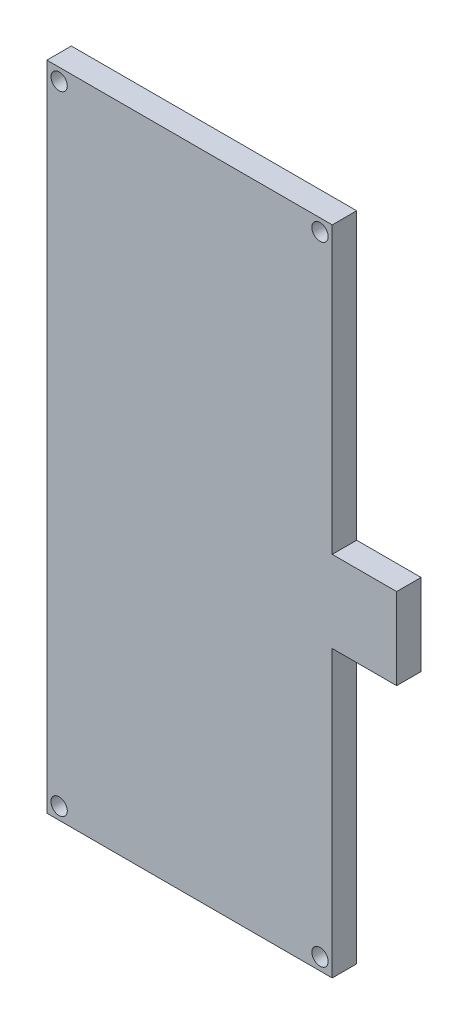
ISO-10303-21;
HEADER;
FILE_DESCRIPTION(('STEP AP214'),'2;1');
FILE_NAME('part.step','',(''),(''),'','','');
FILE_SCHEMA(('AUTOMOTIVE_DESIGN { 1 0 10303 214 1 1 1 1 }'));
ENDSEC;
DATA;
#1=APPLICATION_CONTEXT('core data for automotive mechanical design processes');
#2=APPLICATION_PROTOCOL_DEFINITION('international standard','automotive_design',2000,#1);
#3=PRODUCT_CONTEXT('',#1,'mechanical');
#4=PRODUCT('Part','Part','',(#3));
#5=PRODUCT_RELATED_PRODUCT_CATEGORY('part','',(#4));
#6=PRODUCT_DEFINITION_FORMATION('','',#4);
#7=PRODUCT_DEFINITION_CONTEXT('part definition',#1,'design');
#8=PRODUCT_DEFINITION('design','',#6,#7);
#9=PRODUCT_DEFINITION_SHAPE('','',#8);
#10=(LENGTH_UNIT() NAMED_UNIT(*) SI_UNIT(.MILLI.,.METRE.));
#11=(NAMED_UNIT(*) PLANE_ANGLE_UNIT() SI_UNIT($,.RADIAN.));
#12=(NAMED_UNIT(*) SI_UNIT($,.STERADIAN.) SOLID_ANGLE_UNIT());
#13=UNCERTAINTY_MEASURE_WITH_UNIT(LENGTH_MEASURE(1.E-05),#10,'distance_accuracy_value','');
#14=(GEOMETRIC_REPRESENTATION_CONTEXT(3) GLOBAL_UNCERTAINTY_ASSIGNED_CONTEXT((#13)) GLOBAL_UNIT_ASSIGNED_CONTEXT((#10,
#11,#12)) REPRESENTATION_CONTEXT('',''));
#15=CARTESIAN_POINT('',(0.,0.,0.));
#16=DIRECTION('',(0.,0.,1.));
#17=DIRECTION('',(1.,0.,0.));
#18=AXIS2_PLACEMENT_3D('',#15,#16,#17);
#19=CARTESIAN_POINT('',(17.5,-40.,3.));
#20=DIRECTION('',(-1.,0.,0.));
#21=DIRECTION('',(0.,0.,1.));
#22=AXIS2_PLACEMENT_3D('',#19,#20,#21);
#23=PLANE('',#22);
#24=DIRECTION('',(0.,0.,-1.));
#25=VECTOR('',#24,1.);
#26=CARTESIAN_POINT('',(17.5,-5.,3.));
#27=LINE('',#26,#25);
#28=CARTESIAN_POINT('',(17.5,-5.,3.));
#29=VERTEX_POINT('',#28);
#30=CARTESIAN_POINT('',(17.5,-5.,0.));
#31=VERTEX_POINT('',#30);
#32=EDGE_CURVE('E66',#29,#31,#27,.T.);
#33=ORIENTED_EDGE('',*,*,#32,.F.);
#34=DIRECTION('',(0.,1.,0.));
#35=VECTOR('',#34,1.);
#36=CARTESIAN_POINT('',(17.5,-40.,3.));
#37=LINE('',#36,#35);
#38=CARTESIAN_POINT('',(17.5,-40.,3.));
#39=VERTEX_POINT('',#38);
#40=EDGE_CURVE('E116',#39,#29,#37,.T.);
#41=ORIENTED_EDGE('',*,*,#40,.F.);
#42=DIRECTION('',(0.,0.,-1.));
#43=VECTOR('',#42,1.);
#44=CARTESIAN_POINT('',(17.5,-40.,3.));
#45=LINE('',#44,#43);
#46=CARTESIAN_POINT('',(17.5,-40.,0.));
#47=VERTEX_POINT('',#46);
#48=EDGE_CURVE('E169',#39,#47,#45,.T.);
#49=ORIENTED_EDGE('',*,*,#48,.T.);
#50=DIRECTION('',(0.,1.,0.));
#51=VECTOR('',#50,1.);
#52=CARTESIAN_POINT('',(17.5,-40.,0.));
#53=LINE('',#52,#51);
#54=EDGE_CURVE('E170',#47,#31,#53,.T.);
#55=ORIENTED_EDGE('',*,*,#54,.T.);
#56=EDGE_LOOP('',(#33,#41,#49,#55));
#57=FACE_BOUND('',#56,.T.);
#58=ADVANCED_FACE('F43',(#57),#23,.F.);
#59=DIRECTION('',(0.,0.,1.));
#60=VECTOR('',#59,1.);
#61=CARTESIAN_POINT('',(17.5,5.,3.));
#62=LINE('',#61,#60);
#63=CARTESIAN_POINT('',(17.5,5.,0.));
#64=VERTEX_POINT('',#63);
#65=CARTESIAN_POINT('',(17.5,5.,3.));
#66=VERTEX_POINT('',#65);
#67=EDGE_CURVE('E129',#64,#66,#62,.T.);
#68=ORIENTED_EDGE('',*,*,#67,.F.);
#69=CARTESIAN_POINT('',(17.5,40.,0.));
#70=VERTEX_POINT('',#69);
#71=EDGE_CURVE('E157',#64,#70,#53,.T.);
#72=ORIENTED_EDGE('',*,*,#71,.T.);
#73=DIRECTION('',(0.,0.,-1.));
#74=VECTOR('',#73,1.);
#75=CARTESIAN_POINT('',(17.5,40.,3.));
#76=LINE('',#75,#74);
#77=CARTESIAN_POINT('',(17.5,40.,3.));
#78=VERTEX_POINT('',#77);
#79=EDGE_CURVE('E11',#78,#70,#76,.T.);
#80=ORIENTED_EDGE('',*,*,#79,.F.);
#81=EDGE_CURVE('E58',#66,#78,#37,.T.);
#82=ORIENTED_EDGE('',*,*,#81,.F.);
#83=EDGE_LOOP('',(#68,#72,#80,#82));
#84=FACE_BOUND('',#83,.T.);
#85=ADVANCED_FACE('F212',(#84),#23,.F.);
#86=CARTESIAN_POINT('',(-17.5,40.,3.));
#87=DIRECTION('',(0.,-1.,0.));
#88=DIRECTION('',(0.,0.,-1.));
#89=AXIS2_PLACEMENT_3D('',#86,#87,#88);
#90=PLANE('',#89);
#91=DIRECTION('',(-1.,0.,0.));
#92=VECTOR('',#91,1.);
#93=CARTESIAN_POINT('',(-17.5,40.,0.));
#94=LINE('',#93,#92);
#95=CARTESIAN_POINT('',(-17.5,40.,0.));
#96=VERTEX_POINT('',#95);
#97=EDGE_CURVE('E173',#70,#96,#94,.T.);
#98=ORIENTED_EDGE('',*,*,#97,.T.);
#99=DIRECTION('',(0.,0.,-1.));
#100=VECTOR('',#99,1.);
#101=CARTESIAN_POINT('',(-17.5,40.,3.));
#102=LINE('',#101,#100);
#103=CARTESIAN_POINT('',(-17.5,40.,3.));
#104=VERTEX_POINT('',#103);
#105=EDGE_CURVE('E51',#104,#96,#102,.T.);
#106=ORIENTED_EDGE('',*,*,#105,.F.);
#107=DIRECTION('',(-1.,0.,0.));
#108=VECTOR('',#107,1.);
#109=CARTESIAN_POINT('',(-17.5,40.,3.));
#110=LINE('',#109,#108);
#111=EDGE_CURVE('E160',#78,#104,#110,.T.);
#112=ORIENTED_EDGE('',*,*,#111,.F.);
#113=ORIENTED_EDGE('',*,*,#79,.T.);
#114=EDGE_LOOP('',(#98,#106,#112,#113));
#115=FACE_BOUND('',#114,.T.);
#116=ADVANCED_FACE('F211',(#115),#90,.F.);
#117=CARTESIAN_POINT('',(-17.5,-40.,3.));
#118=DIRECTION('',(1.,0.,0.));
#119=DIRECTION('',(0.,0.,-1.));
#120=AXIS2_PLACEMENT_3D('',#117,#118,#119);
#121=PLANE('',#120);
#122=DIRECTION('',(0.,-1.,0.));
#123=VECTOR('',#122,1.);
#124=CARTESIAN_POINT('',(-17.5,-40.,0.));
#125=LINE('',#124,#123);
#126=CARTESIAN_POINT('',(-17.5,-40.,0.));
#127=VERTEX_POINT('',#126);
#128=EDGE_CURVE('E176',#96,#127,#125,.T.);
#129=ORIENTED_EDGE('',*,*,#128,.T.);
#130=DIRECTION('',(0.,0.,-1.));
#131=VECTOR('',#130,1.);
#132=CARTESIAN_POINT('',(-17.5,-40.,3.));
#133=LINE('',#132,#131);
#134=CARTESIAN_POINT('',(-17.5,-40.,3.));
#135=VERTEX_POINT('',#134);
#136=EDGE_CURVE('E185',#135,#127,#133,.T.);
#137=ORIENTED_EDGE('',*,*,#136,.F.);
#138=DIRECTION('',(0.,-1.,0.));
#139=VECTOR('',#138,1.);
#140=CARTESIAN_POINT('',(-17.5,-40.,3.));
#141=LINE('',#140,#139);
#142=EDGE_CURVE('E163',#104,#135,#141,.T.);
#143=ORIENTED_EDGE('',*,*,#142,.F.);
#144=ORIENTED_EDGE('',*,*,#105,.T.);
#145=EDGE_LOOP('',(#129,#137,#143,#144));
#146=FACE_BOUND('',#145,.T.);
#147=ADVANCED_FACE('F194',(#146),#121,.F.);
#148=CARTESIAN_POINT('',(-17.5,-40.,3.));
#149=DIRECTION('',(0.,1.,0.));
#150=DIRECTION('',(0.,0.,1.));
#151=AXIS2_PLACEMENT_3D('',#148,#149,#150);
#152=PLANE('',#151);
#153=DIRECTION('',(1.,0.,0.));
#154=VECTOR('',#153,1.);
#155=CARTESIAN_POINT('',(-17.5,-40.,0.));
#156=LINE('',#155,#154);
#157=EDGE_CURVE('E179',#127,#47,#156,.T.);
#158=ORIENTED_EDGE('',*,*,#157,.T.);
#159=ORIENTED_EDGE('',*,*,#48,.F.);
#160=DIRECTION('',(1.,0.,0.));
#161=VECTOR('',#160,1.);
#162=CARTESIAN_POINT('',(-17.5,-40.,3.));
#163=LINE('',#162,#161);
#164=EDGE_CURVE('E166',#135,#39,#163,.T.);
#165=ORIENTED_EDGE('',*,*,#164,.F.);
#166=ORIENTED_EDGE('',*,*,#136,.T.);
#167=EDGE_LOOP('',(#158,#159,#165,#166));
#168=FACE_BOUND('',#167,.T.);
#169=ADVANCED_FACE('F205',(#168),#152,.F.);
#170=CARTESIAN_POINT('',(0.,0.,3.));
#171=DIRECTION('',(0.,0.,-1.));
#172=DIRECTION('',(-1.,0.,0.));
#173=AXIS2_PLACEMENT_3D('',#170,#171,#172);
#174=PLANE('',#173);
#175=CARTESIAN_POINT('',(-16.,38.5,3.));
#176=DIRECTION('',(0.,0.,-1.));
#177=DIRECTION('',(-1.,0.,0.));
#178=AXIS2_PLACEMENT_3D('',#175,#176,#177);
#179=CIRCLE('',#178,1.);
#180=CARTESIAN_POINT('',(-17.,38.5,3.));
#181=VERTEX_POINT('',#180);
#182=EDGE_CURVE('E145',#181,#181,#179,.F.);
#183=ORIENTED_EDGE('',*,*,#182,.F.);
#184=EDGE_LOOP('',(#183));
#185=FACE_BOUND('',#184,.T.);
#186=CARTESIAN_POINT('',(16.,-38.5,3.));
#187=DIRECTION('',(0.,0.,-1.));
#188=DIRECTION('',(-1.,0.,0.));
#189=AXIS2_PLACEMENT_3D('',#186,#187,#188);
#190=CIRCLE('',#189,1.);
#191=CARTESIAN_POINT('',(15.,-38.5,3.));
#192=VERTEX_POINT('',#191);
#193=EDGE_CURVE('E374',#192,#192,#190,.F.);
#194=ORIENTED_EDGE('',*,*,#193,.F.);
#195=EDGE_LOOP('',(#194));
#196=FACE_BOUND('',#195,.T.);
#197=CARTESIAN_POINT('',(-16.,-38.5,3.));
#198=DIRECTION('',(0.,0.,-1.));
#199=DIRECTION('',(-1.,0.,0.));
#200=AXIS2_PLACEMENT_3D('',#197,#198,#199);
#201=CIRCLE('',#200,1.);
#202=CARTESIAN_POINT('',(-17.,-38.5,3.));
#203=VERTEX_POINT('',#202);
#204=EDGE_CURVE('E377',#203,#203,#201,.F.);
#205=ORIENTED_EDGE('',*,*,#204,.F.);
#206=EDGE_LOOP('',(#205));
#207=FACE_BOUND('',#206,.T.);
#208=CARTESIAN_POINT('',(16.,38.5,3.));
#209=DIRECTION('',(0.,0.,-1.));
#210=DIRECTION('',(-1.,0.,0.));
#211=AXIS2_PLACEMENT_3D('',#208,#209,#210);
#212=CIRCLE('',#211,1.);
#213=CARTESIAN_POINT('',(15.,38.5,3.));
#214=VERTEX_POINT('',#213);
#215=EDGE_CURVE('E383',#214,#214,#212,.F.);
#216=ORIENTED_EDGE('',*,*,#215,.F.);
#217=EDGE_LOOP('',(#216));
#218=FACE_BOUND('',#217,.T.);
#219=ORIENTED_EDGE('',*,*,#40,.T.);
#220=DIRECTION('',(1.,0.,0.));
#221=VECTOR('',#220,1.);
#222=CARTESIAN_POINT('',(15.4344969314091,-5.,3.));
#223=LINE('',#222,#221);
#224=CARTESIAN_POINT('',(25.4,-5.,3.));
#225=VERTEX_POINT('',#224);
#226=EDGE_CURVE('E109',#29,#225,#223,.T.);
#227=ORIENTED_EDGE('',*,*,#226,.T.);
#228=DIRECTION('',(0.,1.,0.));
#229=VECTOR('',#228,1.);
#230=CARTESIAN_POINT('',(25.4,-5.,3.));
#231=LINE('',#230,#229);
#232=CARTESIAN_POINT('',(25.4,5.,3.));
#233=VERTEX_POINT('',#232);
#234=EDGE_CURVE('E114',#225,#233,#231,.T.);
#235=ORIENTED_EDGE('',*,*,#234,.T.);
#236=DIRECTION('',(-1.,0.,0.));
#237=VECTOR('',#236,1.);
#238=CARTESIAN_POINT('',(15.4344969314091,5.,3.));
#239=LINE('',#238,#237);
#240=EDGE_CURVE('E136',#233,#66,#239,.T.);
#241=ORIENTED_EDGE('',*,*,#240,.T.);
#242=ORIENTED_EDGE('',*,*,#81,.T.);
#243=ORIENTED_EDGE('',*,*,#111,.T.);
#244=ORIENTED_EDGE('',*,*,#142,.T.);
#245=ORIENTED_EDGE('',*,*,#164,.T.);
#246=EDGE_LOOP('',(#219,#227,#235,#241,#242,#243,#244,#245));
#247=FACE_BOUND('',#246,.T.);
#248=ADVANCED_FACE('F111',(#185,#196,#207,#218,#247),#174,.F.);
#249=CARTESIAN_POINT('',(0.,0.,0.));
#250=DIRECTION('',(0.,0.,-1.));
#251=DIRECTION('',(-1.,0.,0.));
#252=AXIS2_PLACEMENT_3D('',#249,#250,#251);
#253=PLANE('',#252);
#254=CARTESIAN_POINT('',(-16.,38.5,0.));
#255=DIRECTION('',(0.,0.,1.));
#256=DIRECTION('',(1.,0.,0.));
#257=AXIS2_PLACEMENT_3D('',#254,#255,#256);
#258=CIRCLE('',#257,1.);
#259=CARTESIAN_POINT('',(-15.,38.5,0.));
#260=VERTEX_POINT('',#259);
#261=EDGE_CURVE('E370',#260,#260,#258,.T.);
#262=ORIENTED_EDGE('',*,*,#261,.T.);
#263=EDGE_LOOP('',(#262));
#264=FACE_BOUND('',#263,.T.);
#265=CARTESIAN_POINT('',(16.,-38.5,0.));
#266=DIRECTION('',(0.,0.,1.));
#267=DIRECTION('',(1.,0.,0.));
#268=AXIS2_PLACEMENT_3D('',#265,#266,#267);
#269=CIRCLE('',#268,1.);
#270=CARTESIAN_POINT('',(17.,-38.5,0.));
#271=VERTEX_POINT('',#270);
#272=EDGE_CURVE('E391',#271,#271,#269,.T.);
#273=ORIENTED_EDGE('',*,*,#272,.T.);
#274=EDGE_LOOP('',(#273));
#275=FACE_BOUND('',#274,.T.);
#276=CARTESIAN_POINT('',(-16.,-38.5,0.));
#277=DIRECTION('',(0.,0.,1.));
#278=DIRECTION('',(1.,0.,0.));
#279=AXIS2_PLACEMENT_3D('',#276,#277,#278);
#280=CIRCLE('',#279,1.);
#281=CARTESIAN_POINT('',(-15.,-38.5,0.));
#282=VERTEX_POINT('',#281);
#283=EDGE_CURVE('E395',#282,#282,#280,.T.);
#284=ORIENTED_EDGE('',*,*,#283,.T.);
#285=EDGE_LOOP('',(#284));
#286=FACE_BOUND('',#285,.T.);
#287=CARTESIAN_POINT('',(16.,38.5,0.));
#288=DIRECTION('',(0.,0.,1.));
#289=DIRECTION('',(1.,0.,0.));
#290=AXIS2_PLACEMENT_3D('',#287,#288,#289);
#291=CIRCLE('',#290,1.);
#292=CARTESIAN_POINT('',(17.,38.5,0.));
#293=VERTEX_POINT('',#292);
#294=EDGE_CURVE('E387',#293,#293,#291,.T.);
#295=ORIENTED_EDGE('',*,*,#294,.T.);
#296=EDGE_LOOP('',(#295));
#297=FACE_BOUND('',#296,.T.);
#298=ORIENTED_EDGE('',*,*,#71,.F.);
#299=DIRECTION('',(-1.,0.,0.));
#300=VECTOR('',#299,1.);
#301=CARTESIAN_POINT('',(15.4344969314091,5.,0.));
#302=LINE('',#301,#300);
#303=CARTESIAN_POINT('',(25.4,5.,0.));
#304=VERTEX_POINT('',#303);
#305=EDGE_CURVE('E119',#304,#64,#302,.T.);
#306=ORIENTED_EDGE('',*,*,#305,.F.);
#307=DIRECTION('',(0.,1.,0.));
#308=VECTOR('',#307,1.);
#309=CARTESIAN_POINT('',(25.4,-5.,0.));
#310=LINE('',#309,#308);
#311=CARTESIAN_POINT('',(25.4,-5.,0.));
#312=VERTEX_POINT('',#311);
#313=EDGE_CURVE('E144',#312,#304,#310,.T.);
#314=ORIENTED_EDGE('',*,*,#313,.F.);
#315=DIRECTION('',(1.,0.,0.));
#316=VECTOR('',#315,1.);
#317=CARTESIAN_POINT('',(15.4344969314091,-5.,0.));
#318=LINE('',#317,#316);
#319=EDGE_CURVE('E125',#31,#312,#318,.T.);
#320=ORIENTED_EDGE('',*,*,#319,.F.);
#321=ORIENTED_EDGE('',*,*,#54,.F.);
#322=ORIENTED_EDGE('',*,*,#157,.F.);
#323=ORIENTED_EDGE('',*,*,#128,.F.);
#324=ORIENTED_EDGE('',*,*,#97,.F.);
#325=EDGE_LOOP('',(#298,#306,#314,#320,#321,#322,#323,#324));
#326=FACE_BOUND('',#325,.T.);
#327=ADVANCED_FACE('F201',(#264,#275,#286,#297,#326),#253,.T.);
#328=CARTESIAN_POINT('',(15.4344969314091,-5.,3.));
#329=DIRECTION('',(0.,1.,0.));
#330=DIRECTION('',(0.,0.,1.));
#331=AXIS2_PLACEMENT_3D('',#328,#329,#330);
#332=PLANE('',#331);
#333=ORIENTED_EDGE('',*,*,#226,.F.);
#334=ORIENTED_EDGE('',*,*,#32,.T.);
#335=ORIENTED_EDGE('',*,*,#319,.T.);
#336=DIRECTION('',(0.,0.,-1.));
#337=VECTOR('',#336,1.);
#338=CARTESIAN_POINT('',(25.4,-5.,3.));
#339=LINE('',#338,#337);
#340=EDGE_CURVE('E122',#225,#312,#339,.T.);
#341=ORIENTED_EDGE('',*,*,#340,.F.);
#342=EDGE_LOOP('',(#333,#334,#335,#341));
#343=FACE_BOUND('',#342,.T.);
#344=ADVANCED_FACE('F123',(#343),#332,.F.);
#345=CARTESIAN_POINT('',(15.4344969314091,5.,3.));
#346=DIRECTION('',(0.,-1.,0.));
#347=DIRECTION('',(0.,0.,-1.));
#348=AXIS2_PLACEMENT_3D('',#345,#346,#347);
#349=PLANE('',#348);
#350=ORIENTED_EDGE('',*,*,#305,.T.);
#351=ORIENTED_EDGE('',*,*,#67,.T.);
#352=ORIENTED_EDGE('',*,*,#240,.F.);
#353=DIRECTION('',(0.,0.,-1.));
#354=VECTOR('',#353,1.);
#355=CARTESIAN_POINT('',(25.4,5.,3.));
#356=LINE('',#355,#354);
#357=EDGE_CURVE('E130',#233,#304,#356,.T.);
#358=ORIENTED_EDGE('',*,*,#357,.T.);
#359=EDGE_LOOP('',(#350,#351,#352,#358));
#360=FACE_BOUND('',#359,.T.);
#361=ADVANCED_FACE('F209',(#360),#349,.F.);
#362=CARTESIAN_POINT('',(25.4,-5.,3.));
#363=DIRECTION('',(-1.,0.,0.));
#364=DIRECTION('',(0.,0.,1.));
#365=AXIS2_PLACEMENT_3D('',#362,#363,#364);
#366=PLANE('',#365);
#367=ORIENTED_EDGE('',*,*,#313,.T.);
#368=ORIENTED_EDGE('',*,*,#357,.F.);
#369=ORIENTED_EDGE('',*,*,#234,.F.);
#370=ORIENTED_EDGE('',*,*,#340,.T.);
#371=EDGE_LOOP('',(#367,#368,#369,#370));
#372=FACE_BOUND('',#371,.T.);
#373=ADVANCED_FACE('F132',(#372),#366,.F.);
#374=CARTESIAN_POINT('',(16.,38.5,20.272));
#375=DIRECTION('',(0.,0.,-1.));
#376=DIRECTION('',(-1.,0.,0.));
#377=AXIS2_PLACEMENT_3D('',#374,#375,#376);
#378=CYLINDRICAL_SURFACE('',#377,1.);
#379=ORIENTED_EDGE('',*,*,#294,.F.);
#380=EDGE_LOOP('',(#379));
#381=FACE_BOUND('',#380,.T.);
#382=ORIENTED_EDGE('',*,*,#215,.T.);
#383=EDGE_LOOP('',(#382));
#384=FACE_BOUND('',#383,.T.);
#385=ADVANCED_FACE('F260',(#381,#384),#378,.F.);
#386=CARTESIAN_POINT('',(-16.,-38.5,20.272));
#387=DIRECTION('',(0.,0.,-1.));
#388=DIRECTION('',(-1.,0.,0.));
#389=AXIS2_PLACEMENT_3D('',#386,#387,#388);
#390=CYLINDRICAL_SURFACE('',#389,1.);
#391=ORIENTED_EDGE('',*,*,#283,.F.);
#392=EDGE_LOOP('',(#391));
#393=FACE_BOUND('',#392,.T.);
#394=ORIENTED_EDGE('',*,*,#204,.T.);
#395=EDGE_LOOP('',(#394));
#396=FACE_BOUND('',#395,.T.);
#397=ADVANCED_FACE('F288',(#393,#396),#390,.F.);
#398=CARTESIAN_POINT('',(16.,-38.5,20.272));
#399=DIRECTION('',(0.,0.,-1.));
#400=DIRECTION('',(-1.,0.,0.));
#401=AXIS2_PLACEMENT_3D('',#398,#399,#400);
#402=CYLINDRICAL_SURFACE('',#401,1.);
#403=ORIENTED_EDGE('',*,*,#272,.F.);
#404=EDGE_LOOP('',(#403));
#405=FACE_BOUND('',#404,.T.);
#406=ORIENTED_EDGE('',*,*,#193,.T.);
#407=EDGE_LOOP('',(#406));
#408=FACE_BOUND('',#407,.T.);
#409=ADVANCED_FACE('F299',(#405,#408),#402,.F.);
#410=CARTESIAN_POINT('',(-16.,38.5,20.272));
#411=DIRECTION('',(0.,0.,-1.));
#412=DIRECTION('',(-1.,0.,0.));
#413=AXIS2_PLACEMENT_3D('',#410,#411,#412);
#414=CYLINDRICAL_SURFACE('',#413,1.);
#415=ORIENTED_EDGE('',*,*,#261,.F.);
#416=EDGE_LOOP('',(#415));
#417=FACE_BOUND('',#416,.T.);
#418=ORIENTED_EDGE('',*,*,#182,.T.);
#419=EDGE_LOOP('',(#418));
#420=FACE_BOUND('',#419,.T.);
#421=ADVANCED_FACE('F310',(#417,#420),#414,.F.);
#422=CLOSED_SHELL('',(#58,#85,#116,#147,#169,#248,#327,#344,#361,#373,#385,#397,#409,#421));
#423=MANIFOLD_SOLID_BREP('B2',#422);
#424=ADVANCED_BREP_SHAPE_REPRESENTATION('',(#18,#423),#14);
#425=SHAPE_DEFINITION_REPRESENTATION(#9,#424);
ENDSEC;
END-ISO-10303-21;
